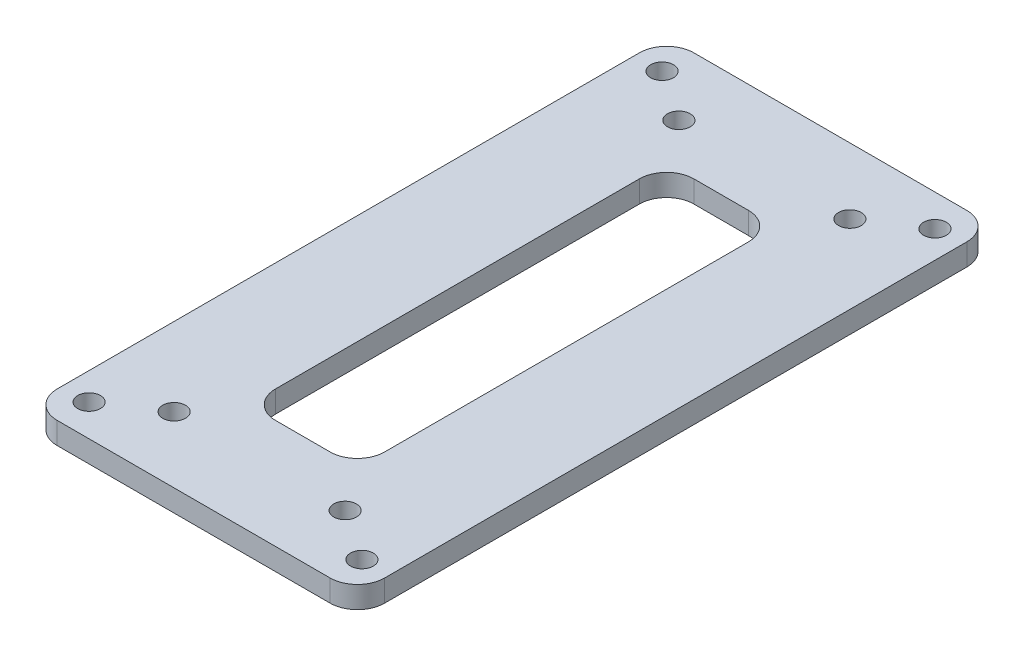
ISO-10303-21;
HEADER;
FILE_DESCRIPTION(('STEP AP214'),'2;1');
FILE_NAME('part.step','',(''),(''),'','','');
FILE_SCHEMA(('AUTOMOTIVE_DESIGN { 1 0 10303 214 1 1 1 1 }'));
ENDSEC;
DATA;
#1=APPLICATION_CONTEXT('core data for automotive mechanical design processes');
#2=APPLICATION_PROTOCOL_DEFINITION('international standard','automotive_design',2000,#1);
#3=PRODUCT_CONTEXT('',#1,'mechanical');
#4=PRODUCT('Part','Part','',(#3));
#5=PRODUCT_RELATED_PRODUCT_CATEGORY('part','',(#4));
#6=PRODUCT_DEFINITION_FORMATION('','',#4);
#7=PRODUCT_DEFINITION_CONTEXT('part definition',#1,'design');
#8=PRODUCT_DEFINITION('design','',#6,#7);
#9=PRODUCT_DEFINITION_SHAPE('','',#8);
#10=(LENGTH_UNIT() NAMED_UNIT(*) SI_UNIT(.MILLI.,.METRE.));
#11=(NAMED_UNIT(*) PLANE_ANGLE_UNIT() SI_UNIT($,.RADIAN.));
#12=(NAMED_UNIT(*) SI_UNIT($,.STERADIAN.) SOLID_ANGLE_UNIT());
#13=UNCERTAINTY_MEASURE_WITH_UNIT(LENGTH_MEASURE(1.E-05),#10,'distance_accuracy_value','');
#14=(GEOMETRIC_REPRESENTATION_CONTEXT(3) GLOBAL_UNCERTAINTY_ASSIGNED_CONTEXT((#13)) GLOBAL_UNIT_ASSIGNED_CONTEXT((#10,
#11,#12)) REPRESENTATION_CONTEXT('',''));
#15=CARTESIAN_POINT('',(0.,0.,0.));
#16=DIRECTION('',(0.,0.,1.));
#17=DIRECTION('',(1.,0.,0.));
#18=AXIS2_PLACEMENT_3D('',#15,#16,#17);
#19=CARTESIAN_POINT('',(0.,2.4,0.));
#20=DIRECTION('',(0.,-1.,0.));
#21=DIRECTION('',(0.,0.,-1.));
#22=AXIS2_PLACEMENT_3D('',#19,#20,#21);
#23=PLANE('',#22);
#24=CARTESIAN_POINT('',(-9.4,2.4,27.75));
#25=DIRECTION('',(0.,1.,0.));
#26=DIRECTION('',(0.,0.,-1.));
#27=AXIS2_PLACEMENT_3D('',#24,#25,#26);
#28=CIRCLE('',#27,1.25);
#29=CARTESIAN_POINT('',(-9.4,2.4,26.5));
#30=VERTEX_POINT('',#29);
#31=EDGE_CURVE('E268',#30,#30,#28,.T.);
#32=ORIENTED_EDGE('',*,*,#31,.F.);
#33=EDGE_LOOP('',(#32));
#34=FACE_BOUND('',#33,.T.);
#35=CARTESIAN_POINT('',(9.4,2.4,27.75));
#36=DIRECTION('',(0.,1.,0.));
#37=DIRECTION('',(0.,0.,1.));
#38=AXIS2_PLACEMENT_3D('',#35,#36,#37);
#39=CIRCLE('',#38,1.25);
#40=CARTESIAN_POINT('',(9.4,2.4,29.));
#41=VERTEX_POINT('',#40);
#42=EDGE_CURVE('E276',#41,#41,#39,.T.);
#43=ORIENTED_EDGE('',*,*,#42,.F.);
#44=EDGE_LOOP('',(#43));
#45=FACE_BOUND('',#44,.T.);
#46=CARTESIAN_POINT('',(9.4,2.4,-27.75));
#47=DIRECTION('',(0.,1.,0.));
#48=DIRECTION('',(0.,0.,-1.));
#49=AXIS2_PLACEMENT_3D('',#46,#47,#48);
#50=CIRCLE('',#49,1.25);
#51=CARTESIAN_POINT('',(9.4,2.4,-29.));
#52=VERTEX_POINT('',#51);
#53=EDGE_CURVE('E282',#52,#52,#50,.T.);
#54=ORIENTED_EDGE('',*,*,#53,.F.);
#55=EDGE_LOOP('',(#54));
#56=FACE_BOUND('',#55,.T.);
#57=CARTESIAN_POINT('',(-9.4,2.4,-27.75));
#58=DIRECTION('',(0.,1.,0.));
#59=DIRECTION('',(0.,0.,1.));
#60=AXIS2_PLACEMENT_3D('',#57,#58,#59);
#61=CIRCLE('',#60,1.25);
#62=CARTESIAN_POINT('',(-9.4,2.4,-26.5));
#63=VERTEX_POINT('',#62);
#64=EDGE_CURVE('E288',#63,#63,#61,.T.);
#65=ORIENTED_EDGE('',*,*,#64,.F.);
#66=EDGE_LOOP('',(#65));
#67=FACE_BOUND('',#66,.T.);
#68=DIRECTION('',(-1.,0.,0.));
#69=VECTOR('',#68,1.);
#70=CARTESIAN_POINT('',(-18.,2.4,-35.));
#71=LINE('',#70,#69);
#72=CARTESIAN_POINT('',(15.,2.4,-35.));
#73=VERTEX_POINT('',#72);
#74=CARTESIAN_POINT('',(-15.,2.4,-35.));
#75=VERTEX_POINT('',#74);
#76=EDGE_CURVE('E297',#73,#75,#71,.T.);
#77=ORIENTED_EDGE('',*,*,#76,.T.);
#78=CARTESIAN_POINT('',(-15.,2.4,-32.));
#79=DIRECTION('',(0.,-1.,0.));
#80=DIRECTION('',(0.,0.,-1.));
#81=AXIS2_PLACEMENT_3D('',#78,#79,#80);
#82=CIRCLE('',#81,3.);
#83=CARTESIAN_POINT('',(-18.,2.4,-32.));
#84=VERTEX_POINT('',#83);
#85=EDGE_CURVE('E218',#75,#84,#82,.F.);
#86=ORIENTED_EDGE('',*,*,#85,.T.);
#87=DIRECTION('',(0.,0.,1.));
#88=VECTOR('',#87,1.);
#89=CARTESIAN_POINT('',(-18.,2.4,35.));
#90=LINE('',#89,#88);
#91=CARTESIAN_POINT('',(-18.,2.4,32.));
#92=VERTEX_POINT('',#91);
#93=EDGE_CURVE('E176',#84,#92,#90,.T.);
#94=ORIENTED_EDGE('',*,*,#93,.T.);
#95=CARTESIAN_POINT('',(-15.,2.4,32.));
#96=DIRECTION('',(0.,-1.,0.));
#97=DIRECTION('',(0.,0.,-1.));
#98=AXIS2_PLACEMENT_3D('',#95,#96,#97);
#99=CIRCLE('',#98,3.);
#100=CARTESIAN_POINT('',(-15.,2.4,35.));
#101=VERTEX_POINT('',#100);
#102=EDGE_CURVE('E57',#92,#101,#99,.F.);
#103=ORIENTED_EDGE('',*,*,#102,.T.);
#104=DIRECTION('',(1.,0.,0.));
#105=VECTOR('',#104,1.);
#106=CARTESIAN_POINT('',(-18.,2.4,35.));
#107=LINE('',#106,#105);
#108=CARTESIAN_POINT('',(15.,2.4,35.));
#109=VERTEX_POINT('',#108);
#110=EDGE_CURVE('E172',#101,#109,#107,.T.);
#111=ORIENTED_EDGE('',*,*,#110,.T.);
#112=CARTESIAN_POINT('',(15.,2.4,32.));
#113=DIRECTION('',(0.,-1.,0.));
#114=DIRECTION('',(0.,0.,-1.));
#115=AXIS2_PLACEMENT_3D('',#112,#113,#114);
#116=CIRCLE('',#115,3.);
#117=CARTESIAN_POINT('',(18.,2.4,32.));
#118=VERTEX_POINT('',#117);
#119=EDGE_CURVE('E214',#109,#118,#116,.F.);
#120=ORIENTED_EDGE('',*,*,#119,.T.);
#121=DIRECTION('',(0.,0.,-1.));
#122=VECTOR('',#121,1.);
#123=CARTESIAN_POINT('',(18.,2.4,35.));
#124=LINE('',#123,#122);
#125=CARTESIAN_POINT('',(18.,2.4,-32.));
#126=VERTEX_POINT('',#125);
#127=EDGE_CURVE('E294',#118,#126,#124,.T.);
#128=ORIENTED_EDGE('',*,*,#127,.T.);
#129=CARTESIAN_POINT('',(15.,2.4,-32.));
#130=DIRECTION('',(0.,-1.,0.));
#131=DIRECTION('',(0.,0.,-1.));
#132=AXIS2_PLACEMENT_3D('',#129,#130,#131);
#133=CIRCLE('',#132,3.);
#134=EDGE_CURVE('E216',#126,#73,#133,.F.);
#135=ORIENTED_EDGE('',*,*,#134,.T.);
#136=EDGE_LOOP('',(#77,#86,#94,#103,#111,#120,#128,#135));
#137=FACE_BOUND('',#136,.T.);
#138=DIRECTION('',(1.,0.,0.));
#139=VECTOR('',#138,1.);
#140=CARTESIAN_POINT('',(-5.99999999999999,2.4,23.));
#141=LINE('',#140,#139);
#142=CARTESIAN_POINT('',(-2.99999999999999,2.4,23.));
#143=VERTEX_POINT('',#142);
#144=CARTESIAN_POINT('',(3.,2.4,23.));
#145=VERTEX_POINT('',#144);
#146=EDGE_CURVE('E168',#143,#145,#141,.T.);
#147=ORIENTED_EDGE('',*,*,#146,.F.);
#148=CARTESIAN_POINT('',(-2.99999999999999,2.4,20.));
#149=DIRECTION('',(0.,-1.,0.));
#150=DIRECTION('',(0.,0.,-1.));
#151=AXIS2_PLACEMENT_3D('',#148,#149,#150);
#152=CIRCLE('',#151,3.);
#153=CARTESIAN_POINT('',(-5.99999999999999,2.4,20.));
#154=VERTEX_POINT('',#153);
#155=EDGE_CURVE('E231',#143,#154,#152,.T.);
#156=ORIENTED_EDGE('',*,*,#155,.T.);
#157=DIRECTION('',(0.,0.,1.));
#158=VECTOR('',#157,1.);
#159=CARTESIAN_POINT('',(-5.99999999999999,2.4,23.));
#160=LINE('',#159,#158);
#161=CARTESIAN_POINT('',(-5.99999999999999,2.4,-20.));
#162=VERTEX_POINT('',#161);
#163=EDGE_CURVE('E275',#162,#154,#160,.T.);
#164=ORIENTED_EDGE('',*,*,#163,.F.);
#165=CARTESIAN_POINT('',(-2.99999999999999,2.4,-20.));
#166=DIRECTION('',(0.,-1.,0.));
#167=DIRECTION('',(0.,0.,-1.));
#168=AXIS2_PLACEMENT_3D('',#165,#166,#167);
#169=CIRCLE('',#168,3.);
#170=CARTESIAN_POINT('',(-2.99999999999999,2.4,-23.));
#171=VERTEX_POINT('',#170);
#172=EDGE_CURVE('E11',#162,#171,#169,.T.);
#173=ORIENTED_EDGE('',*,*,#172,.T.);
#174=DIRECTION('',(-1.,0.,0.));
#175=VECTOR('',#174,1.);
#176=CARTESIAN_POINT('',(-5.99999999999999,2.4,-23.));
#177=LINE('',#176,#175);
#178=CARTESIAN_POINT('',(3.,2.4,-23.));
#179=VERTEX_POINT('',#178);
#180=EDGE_CURVE('E249',#179,#171,#177,.T.);
#181=ORIENTED_EDGE('',*,*,#180,.F.);
#182=CARTESIAN_POINT('',(3.,2.4,-20.));
#183=DIRECTION('',(0.,-1.,0.));
#184=DIRECTION('',(0.,0.,-1.));
#185=AXIS2_PLACEMENT_3D('',#182,#183,#184);
#186=CIRCLE('',#185,3.);
#187=CARTESIAN_POINT('',(6.,2.4,-20.));
#188=VERTEX_POINT('',#187);
#189=EDGE_CURVE('E159',#179,#188,#186,.T.);
#190=ORIENTED_EDGE('',*,*,#189,.T.);
#191=DIRECTION('',(0.,0.,-1.));
#192=VECTOR('',#191,1.);
#193=CARTESIAN_POINT('',(6.,2.4,23.));
#194=LINE('',#193,#192);
#195=CARTESIAN_POINT('',(6.,2.4,20.));
#196=VERTEX_POINT('',#195);
#197=EDGE_CURVE('E246',#196,#188,#194,.T.);
#198=ORIENTED_EDGE('',*,*,#197,.F.);
#199=CARTESIAN_POINT('',(3.,2.4,20.));
#200=DIRECTION('',(0.,-1.,0.));
#201=DIRECTION('',(0.,0.,-1.));
#202=AXIS2_PLACEMENT_3D('',#199,#200,#201);
#203=CIRCLE('',#202,3.);
#204=EDGE_CURVE('E235',#196,#145,#203,.T.);
#205=ORIENTED_EDGE('',*,*,#204,.T.);
#206=EDGE_LOOP('',(#147,#156,#164,#173,#181,#190,#198,#205));
#207=FACE_BOUND('',#206,.T.);
#208=CARTESIAN_POINT('',(-15.,2.4,-31.5));
#209=DIRECTION('',(0.,1.,0.));
#210=DIRECTION('',(0.,0.,1.));
#211=AXIS2_PLACEMENT_3D('',#208,#209,#210);
#212=CIRCLE('',#211,1.25);
#213=CARTESIAN_POINT('',(-15.,2.4,-30.25));
#214=VERTEX_POINT('',#213);
#215=EDGE_CURVE('E587',#214,#214,#212,.T.);
#216=ORIENTED_EDGE('',*,*,#215,.F.);
#217=EDGE_LOOP('',(#216));
#218=FACE_BOUND('',#217,.T.);
#219=CARTESIAN_POINT('',(15.,2.4,-31.5));
#220=DIRECTION('',(0.,1.,0.));
#221=DIRECTION('',(0.,0.,-1.));
#222=AXIS2_PLACEMENT_3D('',#219,#220,#221);
#223=CIRCLE('',#222,1.25);
#224=CARTESIAN_POINT('',(15.,2.4,-32.75));
#225=VERTEX_POINT('',#224);
#226=EDGE_CURVE('E592',#225,#225,#223,.T.);
#227=ORIENTED_EDGE('',*,*,#226,.F.);
#228=EDGE_LOOP('',(#227));
#229=FACE_BOUND('',#228,.T.);
#230=CARTESIAN_POINT('',(-15.,2.4,31.5));
#231=DIRECTION('',(0.,1.,0.));
#232=DIRECTION('',(0.,0.,-1.));
#233=AXIS2_PLACEMENT_3D('',#230,#231,#232);
#234=CIRCLE('',#233,1.25);
#235=CARTESIAN_POINT('',(-15.,2.4,30.25));
#236=VERTEX_POINT('',#235);
#237=EDGE_CURVE('E609',#236,#236,#234,.T.);
#238=ORIENTED_EDGE('',*,*,#237,.F.);
#239=EDGE_LOOP('',(#238));
#240=FACE_BOUND('',#239,.T.);
#241=CARTESIAN_POINT('',(15.,2.4,31.5));
#242=DIRECTION('',(0.,1.,0.));
#243=DIRECTION('',(0.,0.,1.));
#244=AXIS2_PLACEMENT_3D('',#241,#242,#243);
#245=CIRCLE('',#244,1.25);
#246=CARTESIAN_POINT('',(15.,2.4,32.75));
#247=VERTEX_POINT('',#246);
#248=EDGE_CURVE('E614',#247,#247,#245,.T.);
#249=ORIENTED_EDGE('',*,*,#248,.F.);
#250=EDGE_LOOP('',(#249));
#251=FACE_BOUND('',#250,.T.);
#252=ADVANCED_FACE('F35',(#34,#45,#56,#67,#137,#207,#218,#229,#240,#251),#23,.F.);
#253=CARTESIAN_POINT('',(0.,0.,0.));
#254=DIRECTION('',(0.,-1.,0.));
#255=DIRECTION('',(0.,0.,-1.));
#256=AXIS2_PLACEMENT_3D('',#253,#254,#255);
#257=PLANE('',#256);
#258=CARTESIAN_POINT('',(-15.,0.,31.5));
#259=DIRECTION('',(0.,1.,0.));
#260=DIRECTION('',(0.,0.,-1.));
#261=AXIS2_PLACEMENT_3D('',#258,#259,#260);
#262=CIRCLE('',#261,1.25);
#263=CARTESIAN_POINT('',(-15.,0.,30.25));
#264=VERTEX_POINT('',#263);
#265=EDGE_CURVE('E611',#264,#264,#262,.T.);
#266=ORIENTED_EDGE('',*,*,#265,.T.);
#267=EDGE_LOOP('',(#266));
#268=FACE_BOUND('',#267,.T.);
#269=CARTESIAN_POINT('',(-15.,0.,-31.5));
#270=DIRECTION('',(0.,1.,0.));
#271=DIRECTION('',(0.,0.,1.));
#272=AXIS2_PLACEMENT_3D('',#269,#270,#271);
#273=CIRCLE('',#272,1.25);
#274=CARTESIAN_POINT('',(-15.,0.,-30.25));
#275=VERTEX_POINT('',#274);
#276=EDGE_CURVE('E590',#275,#275,#273,.T.);
#277=ORIENTED_EDGE('',*,*,#276,.T.);
#278=EDGE_LOOP('',(#277));
#279=FACE_BOUND('',#278,.T.);
#280=CARTESIAN_POINT('',(9.4,0.,27.75));
#281=DIRECTION('',(0.,1.,0.));
#282=DIRECTION('',(0.,0.,1.));
#283=AXIS2_PLACEMENT_3D('',#280,#281,#282);
#284=CIRCLE('',#283,1.25);
#285=CARTESIAN_POINT('',(9.4,0.,29.));
#286=VERTEX_POINT('',#285);
#287=EDGE_CURVE('E271',#286,#286,#284,.T.);
#288=ORIENTED_EDGE('',*,*,#287,.T.);
#289=EDGE_LOOP('',(#288));
#290=FACE_BOUND('',#289,.T.);
#291=CARTESIAN_POINT('',(-9.4,0.,-27.75));
#292=DIRECTION('',(0.,1.,0.));
#293=DIRECTION('',(0.,0.,1.));
#294=AXIS2_PLACEMENT_3D('',#291,#292,#293);
#295=CIRCLE('',#294,1.25);
#296=CARTESIAN_POINT('',(-9.4,0.,-26.5));
#297=VERTEX_POINT('',#296);
#298=EDGE_CURVE('E285',#297,#297,#295,.T.);
#299=ORIENTED_EDGE('',*,*,#298,.T.);
#300=EDGE_LOOP('',(#299));
#301=FACE_BOUND('',#300,.T.);
#302=DIRECTION('',(0.,0.,1.));
#303=VECTOR('',#302,1.);
#304=CARTESIAN_POINT('',(-18.,0.,35.));
#305=LINE('',#304,#303);
#306=CARTESIAN_POINT('',(-18.,0.,-32.));
#307=VERTEX_POINT('',#306);
#308=CARTESIAN_POINT('',(-18.,0.,32.));
#309=VERTEX_POINT('',#308);
#310=EDGE_CURVE('E305',#307,#309,#305,.T.);
#311=ORIENTED_EDGE('',*,*,#310,.F.);
#312=CARTESIAN_POINT('',(-15.,0.,-32.));
#313=DIRECTION('',(0.,-1.,0.));
#314=DIRECTION('',(0.,0.,-1.));
#315=AXIS2_PLACEMENT_3D('',#312,#313,#314);
#316=CIRCLE('',#315,3.);
#317=CARTESIAN_POINT('',(-15.,0.,-35.));
#318=VERTEX_POINT('',#317);
#319=EDGE_CURVE('E206',#307,#318,#316,.T.);
#320=ORIENTED_EDGE('',*,*,#319,.T.);
#321=DIRECTION('',(-1.,0.,0.));
#322=VECTOR('',#321,1.);
#323=CARTESIAN_POINT('',(-18.,0.,-35.));
#324=LINE('',#323,#322);
#325=CARTESIAN_POINT('',(15.,0.,-35.));
#326=VERTEX_POINT('',#325);
#327=EDGE_CURVE('E303',#326,#318,#324,.T.);
#328=ORIENTED_EDGE('',*,*,#327,.F.);
#329=CARTESIAN_POINT('',(15.,0.,-32.));
#330=DIRECTION('',(0.,-1.,0.));
#331=DIRECTION('',(0.,0.,-1.));
#332=AXIS2_PLACEMENT_3D('',#329,#330,#331);
#333=CIRCLE('',#332,3.);
#334=CARTESIAN_POINT('',(18.,0.,-32.));
#335=VERTEX_POINT('',#334);
#336=EDGE_CURVE('E204',#326,#335,#333,.T.);
#337=ORIENTED_EDGE('',*,*,#336,.T.);
#338=DIRECTION('',(0.,0.,-1.));
#339=VECTOR('',#338,1.);
#340=CARTESIAN_POINT('',(18.,0.,35.));
#341=LINE('',#340,#339);
#342=CARTESIAN_POINT('',(18.,0.,32.));
#343=VERTEX_POINT('',#342);
#344=EDGE_CURVE('E291',#343,#335,#341,.T.);
#345=ORIENTED_EDGE('',*,*,#344,.F.);
#346=CARTESIAN_POINT('',(15.,0.,32.));
#347=DIRECTION('',(0.,-1.,0.));
#348=DIRECTION('',(0.,0.,-1.));
#349=AXIS2_PLACEMENT_3D('',#346,#347,#348);
#350=CIRCLE('',#349,3.);
#351=CARTESIAN_POINT('',(15.,0.,35.));
#352=VERTEX_POINT('',#351);
#353=EDGE_CURVE('E202',#343,#352,#350,.T.);
#354=ORIENTED_EDGE('',*,*,#353,.T.);
#355=DIRECTION('',(1.,0.,0.));
#356=VECTOR('',#355,1.);
#357=CARTESIAN_POINT('',(-18.,0.,35.));
#358=LINE('',#357,#356);
#359=CARTESIAN_POINT('',(-15.,0.,35.));
#360=VERTEX_POINT('',#359);
#361=EDGE_CURVE('E179',#360,#352,#358,.T.);
#362=ORIENTED_EDGE('',*,*,#361,.F.);
#363=CARTESIAN_POINT('',(-15.,0.,32.));
#364=DIRECTION('',(0.,-1.,0.));
#365=DIRECTION('',(0.,0.,-1.));
#366=AXIS2_PLACEMENT_3D('',#363,#364,#365);
#367=CIRCLE('',#366,3.);
#368=EDGE_CURVE('E200',#360,#309,#367,.T.);
#369=ORIENTED_EDGE('',*,*,#368,.T.);
#370=EDGE_LOOP('',(#311,#320,#328,#337,#345,#354,#362,#369));
#371=FACE_BOUND('',#370,.T.);
#372=CARTESIAN_POINT('',(9.4,0.,-27.75));
#373=DIRECTION('',(0.,1.,0.));
#374=DIRECTION('',(0.,0.,-1.));
#375=AXIS2_PLACEMENT_3D('',#372,#373,#374);
#376=CIRCLE('',#375,1.25);
#377=CARTESIAN_POINT('',(9.4,0.,-29.));
#378=VERTEX_POINT('',#377);
#379=EDGE_CURVE('E279',#378,#378,#376,.T.);
#380=ORIENTED_EDGE('',*,*,#379,.T.);
#381=EDGE_LOOP('',(#380));
#382=FACE_BOUND('',#381,.T.);
#383=CARTESIAN_POINT('',(-9.4,0.,27.75));
#384=DIRECTION('',(0.,1.,0.));
#385=DIRECTION('',(0.,0.,-1.));
#386=AXIS2_PLACEMENT_3D('',#383,#384,#385);
#387=CIRCLE('',#386,1.25);
#388=CARTESIAN_POINT('',(-9.4,0.,26.5));
#389=VERTEX_POINT('',#388);
#390=EDGE_CURVE('E272',#389,#389,#387,.T.);
#391=ORIENTED_EDGE('',*,*,#390,.T.);
#392=EDGE_LOOP('',(#391));
#393=FACE_BOUND('',#392,.T.);
#394=DIRECTION('',(-1.,0.,0.));
#395=VECTOR('',#394,1.);
#396=CARTESIAN_POINT('',(-5.99999999999999,0.,-23.));
#397=LINE('',#396,#395);
#398=CARTESIAN_POINT('',(3.,0.,-23.));
#399=VERTEX_POINT('',#398);
#400=CARTESIAN_POINT('',(-2.99999999999999,0.,-23.));
#401=VERTEX_POINT('',#400);
#402=EDGE_CURVE('E154',#399,#401,#397,.T.);
#403=ORIENTED_EDGE('',*,*,#402,.T.);
#404=CARTESIAN_POINT('',(-2.99999999999999,0.,-20.));
#405=DIRECTION('',(0.,-1.,0.));
#406=DIRECTION('',(0.,0.,-1.));
#407=AXIS2_PLACEMENT_3D('',#404,#405,#406);
#408=CIRCLE('',#407,3.);
#409=CARTESIAN_POINT('',(-5.99999999999999,0.,-20.));
#410=VERTEX_POINT('',#409);
#411=EDGE_CURVE('E43',#401,#410,#408,.F.);
#412=ORIENTED_EDGE('',*,*,#411,.T.);
#413=DIRECTION('',(0.,0.,1.));
#414=VECTOR('',#413,1.);
#415=CARTESIAN_POINT('',(-5.99999999999999,0.,23.));
#416=LINE('',#415,#414);
#417=CARTESIAN_POINT('',(-5.99999999999999,0.,20.));
#418=VERTEX_POINT('',#417);
#419=EDGE_CURVE('E152',#410,#418,#416,.T.);
#420=ORIENTED_EDGE('',*,*,#419,.T.);
#421=CARTESIAN_POINT('',(-2.99999999999999,0.,20.));
#422=DIRECTION('',(0.,-1.,0.));
#423=DIRECTION('',(0.,0.,-1.));
#424=AXIS2_PLACEMENT_3D('',#421,#422,#423);
#425=CIRCLE('',#424,3.);
#426=CARTESIAN_POINT('',(-2.99999999999999,0.,23.));
#427=VERTEX_POINT('',#426);
#428=EDGE_CURVE('E229',#418,#427,#425,.F.);
#429=ORIENTED_EDGE('',*,*,#428,.T.);
#430=DIRECTION('',(1.,0.,0.));
#431=VECTOR('',#430,1.);
#432=CARTESIAN_POINT('',(-5.99999999999999,0.,23.));
#433=LINE('',#432,#431);
#434=CARTESIAN_POINT('',(3.,0.,23.));
#435=VERTEX_POINT('',#434);
#436=EDGE_CURVE('E264',#427,#435,#433,.T.);
#437=ORIENTED_EDGE('',*,*,#436,.T.);
#438=CARTESIAN_POINT('',(3.,0.,20.));
#439=DIRECTION('',(0.,-1.,0.));
#440=DIRECTION('',(0.,0.,-1.));
#441=AXIS2_PLACEMENT_3D('',#438,#439,#440);
#442=CIRCLE('',#441,3.);
#443=CARTESIAN_POINT('',(6.,0.,20.));
#444=VERTEX_POINT('',#443);
#445=EDGE_CURVE('E233',#435,#444,#442,.F.);
#446=ORIENTED_EDGE('',*,*,#445,.T.);
#447=DIRECTION('',(0.,0.,-1.));
#448=VECTOR('',#447,1.);
#449=CARTESIAN_POINT('',(6.,0.,23.));
#450=LINE('',#449,#448);
#451=CARTESIAN_POINT('',(6.,0.,-20.));
#452=VERTEX_POINT('',#451);
#453=EDGE_CURVE('E260',#444,#452,#450,.T.);
#454=ORIENTED_EDGE('',*,*,#453,.T.);
#455=CARTESIAN_POINT('',(3.,0.,-20.));
#456=DIRECTION('',(0.,-1.,0.));
#457=DIRECTION('',(0.,0.,-1.));
#458=AXIS2_PLACEMENT_3D('',#455,#456,#457);
#459=CIRCLE('',#458,3.);
#460=EDGE_CURVE('E237',#452,#399,#459,.F.);
#461=ORIENTED_EDGE('',*,*,#460,.T.);
#462=EDGE_LOOP('',(#403,#412,#420,#429,#437,#446,#454,#461));
#463=FACE_BOUND('',#462,.T.);
#464=CARTESIAN_POINT('',(15.,0.,-31.5));
#465=DIRECTION('',(0.,1.,0.));
#466=DIRECTION('',(0.,0.,-1.));
#467=AXIS2_PLACEMENT_3D('',#464,#465,#466);
#468=CIRCLE('',#467,1.25);
#469=CARTESIAN_POINT('',(15.,0.,-32.75));
#470=VERTEX_POINT('',#469);
#471=EDGE_CURVE('E596',#470,#470,#468,.T.);
#472=ORIENTED_EDGE('',*,*,#471,.T.);
#473=EDGE_LOOP('',(#472));
#474=FACE_BOUND('',#473,.T.);
#475=CARTESIAN_POINT('',(15.,0.,31.5));
#476=DIRECTION('',(0.,1.,0.));
#477=DIRECTION('',(0.,0.,1.));
#478=AXIS2_PLACEMENT_3D('',#475,#476,#477);
#479=CIRCLE('',#478,1.25);
#480=CARTESIAN_POINT('',(15.,0.,32.75));
#481=VERTEX_POINT('',#480);
#482=EDGE_CURVE('E617',#481,#481,#479,.T.);
#483=ORIENTED_EDGE('',*,*,#482,.T.);
#484=EDGE_LOOP('',(#483));
#485=FACE_BOUND('',#484,.T.);
#486=ADVANCED_FACE('F150',(#268,#279,#290,#301,#371,#382,#393,#463,#474,#485),#257,.T.);
#487=CARTESIAN_POINT('',(18.,2.4,35.));
#488=DIRECTION('',(-1.,0.,0.));
#489=DIRECTION('',(0.,0.,1.));
#490=AXIS2_PLACEMENT_3D('',#487,#488,#489);
#491=PLANE('',#490);
#492=ORIENTED_EDGE('',*,*,#344,.T.);
#493=DIRECTION('',(0.,-1.,0.));
#494=VECTOR('',#493,1.);
#495=CARTESIAN_POINT('',(18.,2.4,-32.));
#496=LINE('',#495,#494);
#497=EDGE_CURVE('E223',#335,#126,#496,.F.);
#498=ORIENTED_EDGE('',*,*,#497,.T.);
#499=ORIENTED_EDGE('',*,*,#127,.F.);
#500=DIRECTION('',(0.,-1.,0.));
#501=VECTOR('',#500,1.);
#502=CARTESIAN_POINT('',(18.,2.4,32.));
#503=LINE('',#502,#501);
#504=EDGE_CURVE('E220',#118,#343,#503,.T.);
#505=ORIENTED_EDGE('',*,*,#504,.T.);
#506=EDGE_LOOP('',(#492,#498,#499,#505));
#507=FACE_BOUND('',#506,.T.);
#508=ADVANCED_FACE('F321',(#507),#491,.F.);
#509=CARTESIAN_POINT('',(-18.,2.4,-35.));
#510=DIRECTION('',(0.,0.,1.));
#511=DIRECTION('',(1.,0.,0.));
#512=AXIS2_PLACEMENT_3D('',#509,#510,#511);
#513=PLANE('',#512);
#514=ORIENTED_EDGE('',*,*,#327,.T.);
#515=DIRECTION('',(0.,-1.,0.));
#516=VECTOR('',#515,1.);
#517=CARTESIAN_POINT('',(-15.,2.4,-35.));
#518=LINE('',#517,#516);
#519=EDGE_CURVE('E211',#318,#75,#518,.F.);
#520=ORIENTED_EDGE('',*,*,#519,.T.);
#521=ORIENTED_EDGE('',*,*,#76,.F.);
#522=DIRECTION('',(0.,-1.,0.));
#523=VECTOR('',#522,1.);
#524=CARTESIAN_POINT('',(15.,2.4,-35.));
#525=LINE('',#524,#523);
#526=EDGE_CURVE('E208',#73,#326,#525,.T.);
#527=ORIENTED_EDGE('',*,*,#526,.T.);
#528=EDGE_LOOP('',(#514,#520,#521,#527));
#529=FACE_BOUND('',#528,.T.);
#530=ADVANCED_FACE('F330',(#529),#513,.F.);
#531=CARTESIAN_POINT('',(-18.,2.4,35.));
#532=DIRECTION('',(1.,0.,0.));
#533=DIRECTION('',(0.,0.,-1.));
#534=AXIS2_PLACEMENT_3D('',#531,#532,#533);
#535=PLANE('',#534);
#536=ORIENTED_EDGE('',*,*,#93,.F.);
#537=DIRECTION('',(0.,-1.,0.));
#538=VECTOR('',#537,1.);
#539=CARTESIAN_POINT('',(-18.,2.4,-32.));
#540=LINE('',#539,#538);
#541=EDGE_CURVE('E197',#84,#307,#540,.T.);
#542=ORIENTED_EDGE('',*,*,#541,.T.);
#543=ORIENTED_EDGE('',*,*,#310,.T.);
#544=DIRECTION('',(0.,-1.,0.));
#545=VECTOR('',#544,1.);
#546=CARTESIAN_POINT('',(-18.,2.4,32.));
#547=LINE('',#546,#545);
#548=EDGE_CURVE('E195',#309,#92,#547,.F.);
#549=ORIENTED_EDGE('',*,*,#548,.T.);
#550=EDGE_LOOP('',(#536,#542,#543,#549));
#551=FACE_BOUND('',#550,.T.);
#552=ADVANCED_FACE('F337',(#551),#535,.F.);
#553=CARTESIAN_POINT('',(-18.,2.4,35.));
#554=DIRECTION('',(0.,0.,-1.));
#555=DIRECTION('',(-1.,0.,0.));
#556=AXIS2_PLACEMENT_3D('',#553,#554,#555);
#557=PLANE('',#556);
#558=ORIENTED_EDGE('',*,*,#361,.T.);
#559=DIRECTION('',(0.,-1.,0.));
#560=VECTOR('',#559,1.);
#561=CARTESIAN_POINT('',(15.,2.4,35.));
#562=LINE('',#561,#560);
#563=EDGE_CURVE('E50',#352,#109,#562,.F.);
#564=ORIENTED_EDGE('',*,*,#563,.T.);
#565=ORIENTED_EDGE('',*,*,#110,.F.);
#566=DIRECTION('',(0.,-1.,0.));
#567=VECTOR('',#566,1.);
#568=CARTESIAN_POINT('',(-15.,2.4,35.));
#569=LINE('',#568,#567);
#570=EDGE_CURVE('E225',#101,#360,#569,.T.);
#571=ORIENTED_EDGE('',*,*,#570,.T.);
#572=EDGE_LOOP('',(#558,#564,#565,#571));
#573=FACE_BOUND('',#572,.T.);
#574=ADVANCED_FACE('F311',(#573),#557,.F.);
#575=CARTESIAN_POINT('',(-9.4,2.4,-27.75));
#576=DIRECTION('',(0.,-1.,0.));
#577=DIRECTION('',(0.,0.,-1.));
#578=AXIS2_PLACEMENT_3D('',#575,#576,#577);
#579=CYLINDRICAL_SURFACE('',#578,1.25);
#580=ORIENTED_EDGE('',*,*,#64,.T.);
#581=EDGE_LOOP('',(#580));
#582=FACE_BOUND('',#581,.T.);
#583=ORIENTED_EDGE('',*,*,#298,.F.);
#584=EDGE_LOOP('',(#583));
#585=FACE_BOUND('',#584,.T.);
#586=ADVANCED_FACE('F370',(#582,#585),#579,.F.);
#587=CARTESIAN_POINT('',(9.4,2.4,-27.75));
#588=DIRECTION('',(0.,-1.,0.));
#589=DIRECTION('',(0.,0.,-1.));
#590=AXIS2_PLACEMENT_3D('',#587,#588,#589);
#591=CYLINDRICAL_SURFACE('',#590,1.25);
#592=ORIENTED_EDGE('',*,*,#53,.T.);
#593=EDGE_LOOP('',(#592));
#594=FACE_BOUND('',#593,.T.);
#595=ORIENTED_EDGE('',*,*,#379,.F.);
#596=EDGE_LOOP('',(#595));
#597=FACE_BOUND('',#596,.T.);
#598=ADVANCED_FACE('F359',(#594,#597),#591,.F.);
#599=CARTESIAN_POINT('',(9.4,2.4,27.75));
#600=DIRECTION('',(0.,-1.,0.));
#601=DIRECTION('',(0.,0.,-1.));
#602=AXIS2_PLACEMENT_3D('',#599,#600,#601);
#603=CYLINDRICAL_SURFACE('',#602,1.25);
#604=ORIENTED_EDGE('',*,*,#42,.T.);
#605=EDGE_LOOP('',(#604));
#606=FACE_BOUND('',#605,.T.);
#607=ORIENTED_EDGE('',*,*,#287,.F.);
#608=EDGE_LOOP('',(#607));
#609=FACE_BOUND('',#608,.T.);
#610=ADVANCED_FACE('F350',(#606,#609),#603,.F.);
#611=CARTESIAN_POINT('',(-9.4,2.4,27.75));
#612=DIRECTION('',(0.,-1.,0.));
#613=DIRECTION('',(0.,0.,-1.));
#614=AXIS2_PLACEMENT_3D('',#611,#612,#613);
#615=CYLINDRICAL_SURFACE('',#614,1.25);
#616=ORIENTED_EDGE('',*,*,#31,.T.);
#617=EDGE_LOOP('',(#616));
#618=FACE_BOUND('',#617,.T.);
#619=ORIENTED_EDGE('',*,*,#390,.F.);
#620=EDGE_LOOP('',(#619));
#621=FACE_BOUND('',#620,.T.);
#622=ADVANCED_FACE('F347',(#618,#621),#615,.F.);
#623=CARTESIAN_POINT('',(-5.99999999999999,2.4,23.));
#624=DIRECTION('',(0.,0.,-1.));
#625=DIRECTION('',(-1.,0.,0.));
#626=AXIS2_PLACEMENT_3D('',#623,#624,#625);
#627=PLANE('',#626);
#628=ORIENTED_EDGE('',*,*,#436,.F.);
#629=DIRECTION('',(0.,-1.,0.));
#630=VECTOR('',#629,1.);
#631=CARTESIAN_POINT('',(-2.99999999999999,2.4,23.));
#632=LINE('',#631,#630);
#633=EDGE_CURVE('E184',#427,#143,#632,.F.);
#634=ORIENTED_EDGE('',*,*,#633,.T.);
#635=ORIENTED_EDGE('',*,*,#146,.T.);
#636=DIRECTION('',(0.,-1.,0.));
#637=VECTOR('',#636,1.);
#638=CARTESIAN_POINT('',(3.,0.,23.));
#639=LINE('',#638,#637);
#640=EDGE_CURVE('E174',#145,#435,#639,.T.);
#641=ORIENTED_EDGE('',*,*,#640,.T.);
#642=EDGE_LOOP('',(#628,#634,#635,#641));
#643=FACE_BOUND('',#642,.T.);
#644=ADVANCED_FACE('F349',(#643),#627,.T.);
#645=CARTESIAN_POINT('',(6.,2.4,23.));
#646=DIRECTION('',(-1.,0.,0.));
#647=DIRECTION('',(0.,0.,1.));
#648=AXIS2_PLACEMENT_3D('',#645,#646,#647);
#649=PLANE('',#648);
#650=ORIENTED_EDGE('',*,*,#453,.F.);
#651=DIRECTION('',(0.,-1.,0.));
#652=VECTOR('',#651,1.);
#653=CARTESIAN_POINT('',(6.,2.4,20.));
#654=LINE('',#653,#652);
#655=EDGE_CURVE('E189',#444,#196,#654,.F.);
#656=ORIENTED_EDGE('',*,*,#655,.T.);
#657=ORIENTED_EDGE('',*,*,#197,.T.);
#658=DIRECTION('',(0.,-1.,0.));
#659=VECTOR('',#658,1.);
#660=CARTESIAN_POINT('',(6.,0.,-20.));
#661=LINE('',#660,#659);
#662=EDGE_CURVE('E186',#188,#452,#661,.T.);
#663=ORIENTED_EDGE('',*,*,#662,.T.);
#664=EDGE_LOOP('',(#650,#656,#657,#663));
#665=FACE_BOUND('',#664,.T.);
#666=ADVANCED_FACE('F255',(#665),#649,.T.);
#667=CARTESIAN_POINT('',(-5.99999999999999,2.4,-23.));
#668=DIRECTION('',(0.,0.,1.));
#669=DIRECTION('',(1.,0.,0.));
#670=AXIS2_PLACEMENT_3D('',#667,#668,#669);
#671=PLANE('',#670);
#672=ORIENTED_EDGE('',*,*,#402,.F.);
#673=DIRECTION('',(0.,-1.,0.));
#674=VECTOR('',#673,1.);
#675=CARTESIAN_POINT('',(3.,2.4,-23.));
#676=LINE('',#675,#674);
#677=EDGE_CURVE('E193',#399,#179,#676,.F.);
#678=ORIENTED_EDGE('',*,*,#677,.T.);
#679=ORIENTED_EDGE('',*,*,#180,.T.);
#680=DIRECTION('',(0.,-1.,0.));
#681=VECTOR('',#680,1.);
#682=CARTESIAN_POINT('',(-2.99999999999999,0.,-23.));
#683=LINE('',#682,#681);
#684=EDGE_CURVE('E191',#171,#401,#683,.T.);
#685=ORIENTED_EDGE('',*,*,#684,.T.);
#686=EDGE_LOOP('',(#672,#678,#679,#685));
#687=FACE_BOUND('',#686,.T.);
#688=ADVANCED_FACE('F262',(#687),#671,.T.);
#689=CARTESIAN_POINT('',(-5.99999999999999,2.4,23.));
#690=DIRECTION('',(1.,0.,0.));
#691=DIRECTION('',(0.,0.,-1.));
#692=AXIS2_PLACEMENT_3D('',#689,#690,#691);
#693=PLANE('',#692);
#694=ORIENTED_EDGE('',*,*,#163,.T.);
#695=DIRECTION('',(0.,-1.,0.));
#696=VECTOR('',#695,1.);
#697=CARTESIAN_POINT('',(-5.99999999999999,0.,20.));
#698=LINE('',#697,#696);
#699=EDGE_CURVE('E167',#154,#418,#698,.T.);
#700=ORIENTED_EDGE('',*,*,#699,.T.);
#701=ORIENTED_EDGE('',*,*,#419,.F.);
#702=DIRECTION('',(0.,-1.,0.));
#703=VECTOR('',#702,1.);
#704=CARTESIAN_POINT('',(-5.99999999999999,2.4,-20.));
#705=LINE('',#704,#703);
#706=EDGE_CURVE('E164',#410,#162,#705,.F.);
#707=ORIENTED_EDGE('',*,*,#706,.T.);
#708=EDGE_LOOP('',(#694,#700,#701,#707));
#709=FACE_BOUND('',#708,.T.);
#710=ADVANCED_FACE('F163',(#709),#693,.T.);
#711=CARTESIAN_POINT('',(-15.,2.4,-31.5));
#712=DIRECTION('',(0.,-1.,0.));
#713=DIRECTION('',(0.,0.,-1.));
#714=AXIS2_PLACEMENT_3D('',#711,#712,#713);
#715=CYLINDRICAL_SURFACE('',#714,1.25);
#716=ORIENTED_EDGE('',*,*,#215,.T.);
#717=EDGE_LOOP('',(#716));
#718=FACE_BOUND('',#717,.T.);
#719=ORIENTED_EDGE('',*,*,#276,.F.);
#720=EDGE_LOOP('',(#719));
#721=FACE_BOUND('',#720,.T.);
#722=ADVANCED_FACE('F454',(#718,#721),#715,.F.);
#723=CARTESIAN_POINT('',(15.,2.4,-31.5));
#724=DIRECTION('',(0.,-1.,0.));
#725=DIRECTION('',(0.,0.,-1.));
#726=AXIS2_PLACEMENT_3D('',#723,#724,#725);
#727=CYLINDRICAL_SURFACE('',#726,1.25);
#728=ORIENTED_EDGE('',*,*,#226,.T.);
#729=EDGE_LOOP('',(#728));
#730=FACE_BOUND('',#729,.T.);
#731=ORIENTED_EDGE('',*,*,#471,.F.);
#732=EDGE_LOOP('',(#731));
#733=FACE_BOUND('',#732,.T.);
#734=ADVANCED_FACE('F532',(#730,#733),#727,.F.);
#735=CARTESIAN_POINT('',(-15.,2.4,31.5));
#736=DIRECTION('',(0.,-1.,0.));
#737=DIRECTION('',(0.,0.,-1.));
#738=AXIS2_PLACEMENT_3D('',#735,#736,#737);
#739=CYLINDRICAL_SURFACE('',#738,1.25);
#740=ORIENTED_EDGE('',*,*,#237,.T.);
#741=EDGE_LOOP('',(#740));
#742=FACE_BOUND('',#741,.T.);
#743=ORIENTED_EDGE('',*,*,#265,.F.);
#744=EDGE_LOOP('',(#743));
#745=FACE_BOUND('',#744,.T.);
#746=ADVANCED_FACE('F522',(#742,#745),#739,.F.);
#747=CARTESIAN_POINT('',(15.,2.4,31.5));
#748=DIRECTION('',(0.,-1.,0.));
#749=DIRECTION('',(0.,0.,-1.));
#750=AXIS2_PLACEMENT_3D('',#747,#748,#749);
#751=CYLINDRICAL_SURFACE('',#750,1.25);
#752=ORIENTED_EDGE('',*,*,#248,.T.);
#753=EDGE_LOOP('',(#752));
#754=FACE_BOUND('',#753,.T.);
#755=ORIENTED_EDGE('',*,*,#482,.F.);
#756=EDGE_LOOP('',(#755));
#757=FACE_BOUND('',#756,.T.);
#758=ADVANCED_FACE('F385',(#754,#757),#751,.F.);
#759=CARTESIAN_POINT('',(-2.99999999999999,2.4,20.));
#760=DIRECTION('',(0.,1.,0.));
#761=DIRECTION('',(0.,0.,1.));
#762=AXIS2_PLACEMENT_3D('',#759,#760,#761);
#763=CYLINDRICAL_SURFACE('',#762,3.);
#764=ORIENTED_EDGE('',*,*,#155,.F.);
#765=ORIENTED_EDGE('',*,*,#633,.F.);
#766=ORIENTED_EDGE('',*,*,#428,.F.);
#767=ORIENTED_EDGE('',*,*,#699,.F.);
#768=EDGE_LOOP('',(#764,#765,#766,#767));
#769=FACE_BOUND('',#768,.T.);
#770=ADVANCED_FACE('F381',(#769),#763,.F.);
#771=CARTESIAN_POINT('',(3.,2.4,20.));
#772=DIRECTION('',(0.,1.,0.));
#773=DIRECTION('',(0.,0.,1.));
#774=AXIS2_PLACEMENT_3D('',#771,#772,#773);
#775=CYLINDRICAL_SURFACE('',#774,3.);
#776=ORIENTED_EDGE('',*,*,#204,.F.);
#777=ORIENTED_EDGE('',*,*,#655,.F.);
#778=ORIENTED_EDGE('',*,*,#445,.F.);
#779=ORIENTED_EDGE('',*,*,#640,.F.);
#780=EDGE_LOOP('',(#776,#777,#778,#779));
#781=FACE_BOUND('',#780,.T.);
#782=ADVANCED_FACE('F384',(#781),#775,.F.);
#783=CARTESIAN_POINT('',(3.,2.4,-20.));
#784=DIRECTION('',(0.,1.,0.));
#785=DIRECTION('',(0.,0.,1.));
#786=AXIS2_PLACEMENT_3D('',#783,#784,#785);
#787=CYLINDRICAL_SURFACE('',#786,3.);
#788=ORIENTED_EDGE('',*,*,#189,.F.);
#789=ORIENTED_EDGE('',*,*,#677,.F.);
#790=ORIENTED_EDGE('',*,*,#460,.F.);
#791=ORIENTED_EDGE('',*,*,#662,.F.);
#792=EDGE_LOOP('',(#788,#789,#790,#791));
#793=FACE_BOUND('',#792,.T.);
#794=ADVANCED_FACE('F259',(#793),#787,.F.);
#795=CARTESIAN_POINT('',(-2.99999999999999,2.4,-20.));
#796=DIRECTION('',(0.,1.,0.));
#797=DIRECTION('',(0.,0.,1.));
#798=AXIS2_PLACEMENT_3D('',#795,#796,#797);
#799=CYLINDRICAL_SURFACE('',#798,3.);
#800=ORIENTED_EDGE('',*,*,#172,.F.);
#801=ORIENTED_EDGE('',*,*,#706,.F.);
#802=ORIENTED_EDGE('',*,*,#411,.F.);
#803=ORIENTED_EDGE('',*,*,#684,.F.);
#804=EDGE_LOOP('',(#800,#801,#802,#803));
#805=FACE_BOUND('',#804,.T.);
#806=ADVANCED_FACE('F171',(#805),#799,.F.);
#807=CARTESIAN_POINT('',(-15.,2.4,-32.));
#808=DIRECTION('',(0.,-1.,0.));
#809=DIRECTION('',(0.,0.,-1.));
#810=AXIS2_PLACEMENT_3D('',#807,#808,#809);
#811=CYLINDRICAL_SURFACE('',#810,3.);
#812=ORIENTED_EDGE('',*,*,#85,.F.);
#813=ORIENTED_EDGE('',*,*,#519,.F.);
#814=ORIENTED_EDGE('',*,*,#319,.F.);
#815=ORIENTED_EDGE('',*,*,#541,.F.);
#816=EDGE_LOOP('',(#812,#813,#814,#815));
#817=FACE_BOUND('',#816,.T.);
#818=ADVANCED_FACE('F334',(#817),#811,.T.);
#819=CARTESIAN_POINT('',(15.,2.4,-32.));
#820=DIRECTION('',(0.,-1.,0.));
#821=DIRECTION('',(0.,0.,-1.));
#822=AXIS2_PLACEMENT_3D('',#819,#820,#821);
#823=CYLINDRICAL_SURFACE('',#822,3.);
#824=ORIENTED_EDGE('',*,*,#134,.F.);
#825=ORIENTED_EDGE('',*,*,#497,.F.);
#826=ORIENTED_EDGE('',*,*,#336,.F.);
#827=ORIENTED_EDGE('',*,*,#526,.F.);
#828=EDGE_LOOP('',(#824,#825,#826,#827));
#829=FACE_BOUND('',#828,.T.);
#830=ADVANCED_FACE('F325',(#829),#823,.T.);
#831=CARTESIAN_POINT('',(15.,2.4,32.));
#832=DIRECTION('',(0.,-1.,0.));
#833=DIRECTION('',(0.,0.,-1.));
#834=AXIS2_PLACEMENT_3D('',#831,#832,#833);
#835=CYLINDRICAL_SURFACE('',#834,3.);
#836=ORIENTED_EDGE('',*,*,#119,.F.);
#837=ORIENTED_EDGE('',*,*,#563,.F.);
#838=ORIENTED_EDGE('',*,*,#353,.F.);
#839=ORIENTED_EDGE('',*,*,#504,.F.);
#840=EDGE_LOOP('',(#836,#837,#838,#839));
#841=FACE_BOUND('',#840,.T.);
#842=ADVANCED_FACE('F316',(#841),#835,.T.);
#843=CARTESIAN_POINT('',(-15.,2.4,32.));
#844=DIRECTION('',(0.,-1.,0.));
#845=DIRECTION('',(0.,0.,-1.));
#846=AXIS2_PLACEMENT_3D('',#843,#844,#845);
#847=CYLINDRICAL_SURFACE('',#846,3.);
#848=ORIENTED_EDGE('',*,*,#102,.F.);
#849=ORIENTED_EDGE('',*,*,#548,.F.);
#850=ORIENTED_EDGE('',*,*,#368,.F.);
#851=ORIENTED_EDGE('',*,*,#570,.F.);
#852=EDGE_LOOP('',(#848,#849,#850,#851));
#853=FACE_BOUND('',#852,.T.);
#854=ADVANCED_FACE('F37',(#853),#847,.T.);
#855=CLOSED_SHELL('',(#252,#486,#508,#530,#552,#574,#586,#598,#610,#622,#644,#666,#688,#710,
#722,#734,#746,#758,#770,#782,#794,#806,#818,#830,#842,#854));
#856=MANIFOLD_SOLID_BREP('B2',#855);
#857=ADVANCED_BREP_SHAPE_REPRESENTATION('',(#18,#856),#14);
#858=SHAPE_DEFINITION_REPRESENTATION(#9,#857);
ENDSEC;
END-ISO-10303-21;
